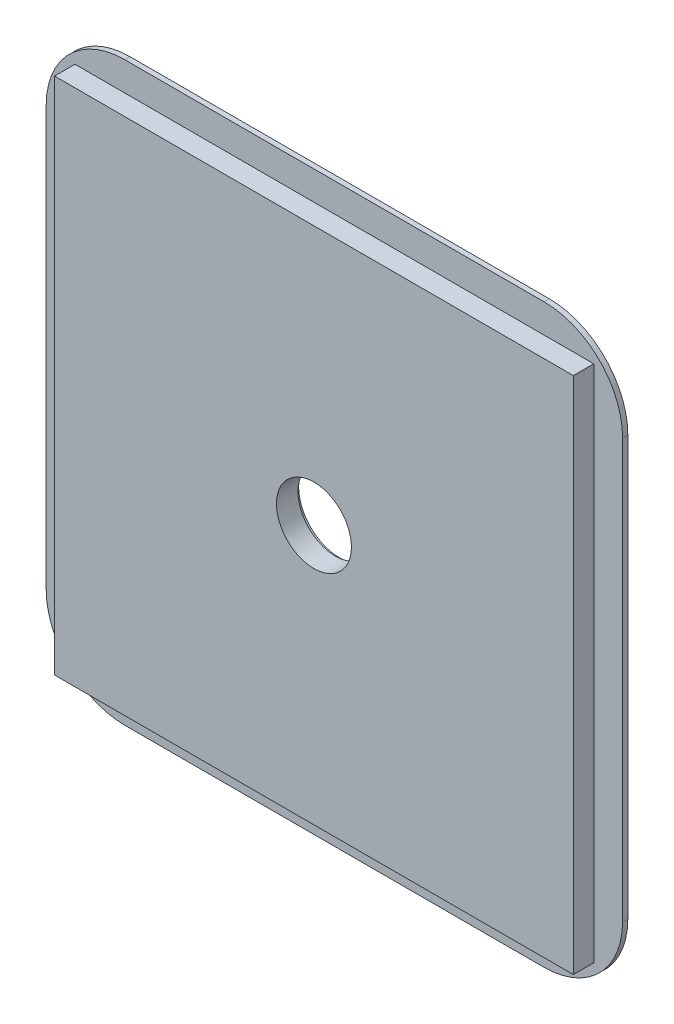
ISO-10303-21;
HEADER;
FILE_DESCRIPTION(('STEP AP214'),'2;1');
FILE_NAME('part.step','',(''),(''),'','','');
FILE_SCHEMA(('AUTOMOTIVE_DESIGN { 1 0 10303 214 1 1 1 1 }'));
ENDSEC;
DATA;
#1=APPLICATION_CONTEXT('core data for automotive mechanical design processes');
#2=APPLICATION_PROTOCOL_DEFINITION('international standard','automotive_design',2000,#1);
#3=PRODUCT_CONTEXT('',#1,'mechanical');
#4=PRODUCT('Part','Part','',(#3));
#5=PRODUCT_RELATED_PRODUCT_CATEGORY('part','',(#4));
#6=PRODUCT_DEFINITION_FORMATION('','',#4);
#7=PRODUCT_DEFINITION_CONTEXT('part definition',#1,'design');
#8=PRODUCT_DEFINITION('design','',#6,#7);
#9=PRODUCT_DEFINITION_SHAPE('','',#8);
#10=(LENGTH_UNIT() NAMED_UNIT(*) SI_UNIT(.MILLI.,.METRE.));
#11=(NAMED_UNIT(*) PLANE_ANGLE_UNIT() SI_UNIT($,.RADIAN.));
#12=(NAMED_UNIT(*) SI_UNIT($,.STERADIAN.) SOLID_ANGLE_UNIT());
#13=UNCERTAINTY_MEASURE_WITH_UNIT(LENGTH_MEASURE(1.E-05),#10,'distance_accuracy_value','');
#14=(GEOMETRIC_REPRESENTATION_CONTEXT(3) GLOBAL_UNCERTAINTY_ASSIGNED_CONTEXT((#13)) GLOBAL_UNIT_ASSIGNED_CONTEXT((#10,
#11,#12)) REPRESENTATION_CONTEXT('',''));
#15=CARTESIAN_POINT('',(0.,0.,0.));
#16=DIRECTION('',(0.,0.,1.));
#17=DIRECTION('',(1.,0.,0.));
#18=AXIS2_PLACEMENT_3D('',#15,#16,#17);
#19=CARTESIAN_POINT('',(0.,0.,3.9));
#20=DIRECTION('',(0.,0.,-1.));
#21=DIRECTION('',(-1.,0.,0.));
#22=AXIS2_PLACEMENT_3D('',#19,#20,#21);
#23=CYLINDRICAL_SURFACE('',#22,7.15);
#24=CARTESIAN_POINT('',(0.,0.,3.9));
#25=DIRECTION('',(0.,0.,-1.));
#26=DIRECTION('',(-1.,0.,0.));
#27=AXIS2_PLACEMENT_3D('',#24,#25,#26);
#28=CIRCLE('',#27,7.15);
#29=CARTESIAN_POINT('',(-7.15,0.,3.9));
#30=VERTEX_POINT('',#29);
#31=EDGE_CURVE('E178',#30,#30,#28,.T.);
#32=ORIENTED_EDGE('',*,*,#31,.F.);
#33=EDGE_LOOP('',(#32));
#34=FACE_BOUND('',#33,.T.);
#35=CARTESIAN_POINT('',(0.,0.,-0.2));
#36=DIRECTION('',(0.,0.,-1.));
#37=DIRECTION('',(-1.,0.,0.));
#38=AXIS2_PLACEMENT_3D('',#35,#36,#37);
#39=CIRCLE('',#38,7.15);
#40=CARTESIAN_POINT('',(-7.15,0.,-0.2));
#41=VERTEX_POINT('',#40);
#42=EDGE_CURVE('E174',#41,#41,#39,.F.);
#43=ORIENTED_EDGE('',*,*,#42,.F.);
#44=EDGE_LOOP('',(#43));
#45=FACE_BOUND('',#44,.T.);
#46=ADVANCED_FACE('F41',(#34,#45),#23,.F.);
#47=CARTESIAN_POINT('',(49.4999999999877,49.5000000000019,3.9));
#48=DIRECTION('',(-1.,0.,0.));
#49=DIRECTION('',(0.,0.,1.));
#50=AXIS2_PLACEMENT_3D('',#47,#48,#49);
#51=PLANE('',#50);
#52=DIRECTION('',(0.,1.,0.));
#53=VECTOR('',#52,1.);
#54=CARTESIAN_POINT('',(49.4999999999877,49.5000000000019,0.));
#55=LINE('',#54,#53);
#56=CARTESIAN_POINT('',(49.4999999999877,-49.4999999999877,0.));
#57=VERTEX_POINT('',#56);
#58=CARTESIAN_POINT('',(49.4999999999877,49.5000000000019,0.));
#59=VERTEX_POINT('',#58);
#60=EDGE_CURVE('E134',#57,#59,#55,.T.);
#61=ORIENTED_EDGE('',*,*,#60,.T.);
#62=DIRECTION('',(0.,0.,-1.));
#63=VECTOR('',#62,1.);
#64=CARTESIAN_POINT('',(49.4999999999877,49.5000000000019,3.9));
#65=LINE('',#64,#63);
#66=CARTESIAN_POINT('',(49.4999999999877,49.5000000000019,3.9));
#67=VERTEX_POINT('',#66);
#68=EDGE_CURVE('E144',#67,#59,#65,.T.);
#69=ORIENTED_EDGE('',*,*,#68,.F.);
#70=DIRECTION('',(0.,1.,0.));
#71=VECTOR('',#70,1.);
#72=CARTESIAN_POINT('',(49.4999999999877,49.5000000000019,3.9));
#73=LINE('',#72,#71);
#74=CARTESIAN_POINT('',(49.4999999999877,-49.4999999999877,3.9));
#75=VERTEX_POINT('',#74);
#76=EDGE_CURVE('E169',#75,#67,#73,.T.);
#77=ORIENTED_EDGE('',*,*,#76,.F.);
#78=DIRECTION('',(0.,0.,-1.));
#79=VECTOR('',#78,1.);
#80=CARTESIAN_POINT('',(49.4999999999877,-49.4999999999877,3.9));
#81=LINE('',#80,#79);
#82=EDGE_CURVE('E156',#75,#57,#81,.T.);
#83=ORIENTED_EDGE('',*,*,#82,.T.);
#84=EDGE_LOOP('',(#61,#69,#77,#83));
#85=FACE_BOUND('',#84,.T.);
#86=ADVANCED_FACE('F152',(#85),#51,.F.);
#87=CARTESIAN_POINT('',(-49.5000000000019,49.5000000000019,3.9));
#88=DIRECTION('',(0.,-1.,0.));
#89=DIRECTION('',(0.,0.,-1.));
#90=AXIS2_PLACEMENT_3D('',#87,#88,#89);
#91=PLANE('',#90);
#92=DIRECTION('',(-1.,0.,0.));
#93=VECTOR('',#92,1.);
#94=CARTESIAN_POINT('',(-49.5000000000019,49.5000000000019,0.));
#95=LINE('',#94,#93);
#96=CARTESIAN_POINT('',(-49.5000000000019,49.5000000000019,0.));
#97=VERTEX_POINT('',#96);
#98=EDGE_CURVE('E128',#59,#97,#95,.T.);
#99=ORIENTED_EDGE('',*,*,#98,.T.);
#100=DIRECTION('',(0.,0.,-1.));
#101=VECTOR('',#100,1.);
#102=CARTESIAN_POINT('',(-49.5000000000019,49.5000000000019,3.9));
#103=LINE('',#102,#101);
#104=CARTESIAN_POINT('',(-49.5000000000019,49.5000000000019,3.9));
#105=VERTEX_POINT('',#104);
#106=EDGE_CURVE('E153',#105,#97,#103,.T.);
#107=ORIENTED_EDGE('',*,*,#106,.F.);
#108=DIRECTION('',(-1.,0.,0.));
#109=VECTOR('',#108,1.);
#110=CARTESIAN_POINT('',(-49.5000000000019,49.5000000000019,3.9));
#111=LINE('',#110,#109);
#112=EDGE_CURVE('E147',#67,#105,#111,.T.);
#113=ORIENTED_EDGE('',*,*,#112,.F.);
#114=ORIENTED_EDGE('',*,*,#68,.T.);
#115=EDGE_LOOP('',(#99,#107,#113,#114));
#116=FACE_BOUND('',#115,.T.);
#117=ADVANCED_FACE('F143',(#116),#91,.F.);
#118=CARTESIAN_POINT('',(-49.5000000000019,49.5000000000019,3.9));
#119=DIRECTION('',(1.,0.,0.));
#120=DIRECTION('',(0.,0.,-1.));
#121=AXIS2_PLACEMENT_3D('',#118,#119,#120);
#122=PLANE('',#121);
#123=DIRECTION('',(0.,-1.,0.));
#124=VECTOR('',#123,1.);
#125=CARTESIAN_POINT('',(-49.5000000000019,49.5000000000019,0.));
#126=LINE('',#125,#124);
#127=CARTESIAN_POINT('',(-49.5000000000019,-49.4999999999877,0.));
#128=VERTEX_POINT('',#127);
#129=EDGE_CURVE('E137',#97,#128,#126,.T.);
#130=ORIENTED_EDGE('',*,*,#129,.T.);
#131=DIRECTION('',(0.,0.,-1.));
#132=VECTOR('',#131,1.);
#133=CARTESIAN_POINT('',(-49.5000000000019,-49.4999999999877,3.9));
#134=LINE('',#133,#132);
#135=CARTESIAN_POINT('',(-49.5000000000019,-49.4999999999877,3.9));
#136=VERTEX_POINT('',#135);
#137=EDGE_CURVE('E171',#136,#128,#134,.T.);
#138=ORIENTED_EDGE('',*,*,#137,.F.);
#139=DIRECTION('',(0.,-1.,0.));
#140=VECTOR('',#139,1.);
#141=CARTESIAN_POINT('',(-49.5000000000019,49.5000000000019,3.9));
#142=LINE('',#141,#140);
#143=EDGE_CURVE('E231',#105,#136,#142,.T.);
#144=ORIENTED_EDGE('',*,*,#143,.F.);
#145=ORIENTED_EDGE('',*,*,#106,.T.);
#146=EDGE_LOOP('',(#130,#138,#144,#145));
#147=FACE_BOUND('',#146,.T.);
#148=ADVANCED_FACE('F245',(#147),#122,.F.);
#149=CARTESIAN_POINT('',(-49.5000000000019,-49.4999999999877,3.9));
#150=DIRECTION('',(0.,1.,0.));
#151=DIRECTION('',(0.,0.,1.));
#152=AXIS2_PLACEMENT_3D('',#149,#150,#151);
#153=PLANE('',#152);
#154=DIRECTION('',(1.,0.,0.));
#155=VECTOR('',#154,1.);
#156=CARTESIAN_POINT('',(-49.5000000000019,-49.4999999999877,0.));
#157=LINE('',#156,#155);
#158=EDGE_CURVE('E170',#128,#57,#157,.T.);
#159=ORIENTED_EDGE('',*,*,#158,.T.);
#160=ORIENTED_EDGE('',*,*,#82,.F.);
#161=DIRECTION('',(1.,0.,0.));
#162=VECTOR('',#161,1.);
#163=CARTESIAN_POINT('',(-49.5000000000019,-49.4999999999877,3.9));
#164=LINE('',#163,#162);
#165=EDGE_CURVE('E161',#136,#75,#164,.T.);
#166=ORIENTED_EDGE('',*,*,#165,.F.);
#167=ORIENTED_EDGE('',*,*,#137,.T.);
#168=EDGE_LOOP('',(#159,#160,#166,#167));
#169=FACE_BOUND('',#168,.T.);
#170=ADVANCED_FACE('F239',(#169),#153,.F.);
#171=CARTESIAN_POINT('',(0.,0.,3.9));
#172=DIRECTION('',(0.,0.,1.));
#173=DIRECTION('',(1.,0.,0.));
#174=AXIS2_PLACEMENT_3D('',#171,#172,#173);
#175=PLANE('',#174);
#176=ORIENTED_EDGE('',*,*,#31,.T.);
#177=EDGE_LOOP('',(#176));
#178=FACE_BOUND('',#177,.T.);
#179=ORIENTED_EDGE('',*,*,#76,.T.);
#180=ORIENTED_EDGE('',*,*,#112,.T.);
#181=ORIENTED_EDGE('',*,*,#143,.T.);
#182=ORIENTED_EDGE('',*,*,#165,.T.);
#183=EDGE_LOOP('',(#179,#180,#181,#182));
#184=FACE_BOUND('',#183,.T.);
#185=ADVANCED_FACE('F238',(#178,#184),#175,.T.);
#186=CARTESIAN_POINT('',(-55.,55.,-1.));
#187=DIRECTION('',(1.,0.,0.));
#188=DIRECTION('',(0.,1.,0.));
#189=AXIS2_PLACEMENT_3D('',#186,#187,#188);
#190=PLANE('',#189);
#191=DIRECTION('',(0.,1.,0.));
#192=VECTOR('',#191,1.);
#193=CARTESIAN_POINT('',(-55.,55.,-1.));
#194=LINE('',#193,#192);
#195=CARTESIAN_POINT('',(-55.,-40.,-1.));
#196=VERTEX_POINT('',#195);
#197=CARTESIAN_POINT('',(-55.,40.,-1.));
#198=VERTEX_POINT('',#197);
#199=EDGE_CURVE('E233',#196,#198,#194,.T.);
#200=ORIENTED_EDGE('',*,*,#199,.F.);
#201=DIRECTION('',(0.,0.,1.));
#202=VECTOR('',#201,1.);
#203=CARTESIAN_POINT('',(-55.,-40.,-1.));
#204=LINE('',#203,#202);
#205=CARTESIAN_POINT('',(-55.,-40.,0.));
#206=VERTEX_POINT('',#205);
#207=EDGE_CURVE('E181',#196,#206,#204,.T.);
#208=ORIENTED_EDGE('',*,*,#207,.T.);
#209=DIRECTION('',(0.,1.,0.));
#210=VECTOR('',#209,1.);
#211=CARTESIAN_POINT('',(-55.,55.,0.));
#212=LINE('',#211,#210);
#213=CARTESIAN_POINT('',(-55.,40.,0.));
#214=VERTEX_POINT('',#213);
#215=EDGE_CURVE('E222',#206,#214,#212,.T.);
#216=ORIENTED_EDGE('',*,*,#215,.T.);
#217=DIRECTION('',(0.,0.,1.));
#218=VECTOR('',#217,1.);
#219=CARTESIAN_POINT('',(-55.,40.,-1.));
#220=LINE('',#219,#218);
#221=EDGE_CURVE('E148',#214,#198,#220,.F.);
#222=ORIENTED_EDGE('',*,*,#221,.T.);
#223=EDGE_LOOP('',(#200,#208,#216,#222));
#224=FACE_BOUND('',#223,.T.);
#225=ADVANCED_FACE('F285',(#224),#190,.F.);
#226=CARTESIAN_POINT('',(55.,55.,-1.));
#227=DIRECTION('',(0.,-1.,0.));
#228=DIRECTION('',(0.,0.,-1.));
#229=AXIS2_PLACEMENT_3D('',#226,#227,#228);
#230=PLANE('',#229);
#231=DIRECTION('',(1.,0.,0.));
#232=VECTOR('',#231,1.);
#233=CARTESIAN_POINT('',(55.,55.,-1.));
#234=LINE('',#233,#232);
#235=CARTESIAN_POINT('',(-40.,55.,-1.));
#236=VERTEX_POINT('',#235);
#237=CARTESIAN_POINT('',(40.,55.,-1.));
#238=VERTEX_POINT('',#237);
#239=EDGE_CURVE('E218',#236,#238,#234,.T.);
#240=ORIENTED_EDGE('',*,*,#239,.F.);
#241=DIRECTION('',(0.,0.,1.));
#242=VECTOR('',#241,1.);
#243=CARTESIAN_POINT('',(-40.,55.,-1.));
#244=LINE('',#243,#242);
#245=CARTESIAN_POINT('',(-40.,55.,0.));
#246=VERTEX_POINT('',#245);
#247=EDGE_CURVE('E207',#236,#246,#244,.T.);
#248=ORIENTED_EDGE('',*,*,#247,.T.);
#249=DIRECTION('',(1.,0.,0.));
#250=VECTOR('',#249,1.);
#251=CARTESIAN_POINT('',(55.,55.,0.));
#252=LINE('',#251,#250);
#253=CARTESIAN_POINT('',(40.,55.,0.));
#254=VERTEX_POINT('',#253);
#255=EDGE_CURVE('E211',#246,#254,#252,.T.);
#256=ORIENTED_EDGE('',*,*,#255,.T.);
#257=DIRECTION('',(0.,0.,1.));
#258=VECTOR('',#257,1.);
#259=CARTESIAN_POINT('',(40.,55.,-1.));
#260=LINE('',#259,#258);
#261=EDGE_CURVE('E203',#254,#238,#260,.F.);
#262=ORIENTED_EDGE('',*,*,#261,.T.);
#263=EDGE_LOOP('',(#240,#248,#256,#262));
#264=FACE_BOUND('',#263,.T.);
#265=ADVANCED_FACE('F214',(#264),#230,.F.);
#266=CARTESIAN_POINT('',(55.,55.,-1.));
#267=DIRECTION('',(-1.,0.,0.));
#268=DIRECTION('',(0.,-1.,0.));
#269=AXIS2_PLACEMENT_3D('',#266,#267,#268);
#270=PLANE('',#269);
#271=DIRECTION('',(0.,-1.,0.));
#272=VECTOR('',#271,1.);
#273=CARTESIAN_POINT('',(55.,55.,-1.));
#274=LINE('',#273,#272);
#275=CARTESIAN_POINT('',(55.,40.,-1.));
#276=VERTEX_POINT('',#275);
#277=CARTESIAN_POINT('',(55.,-40.,-1.));
#278=VERTEX_POINT('',#277);
#279=EDGE_CURVE('E159',#276,#278,#274,.T.);
#280=ORIENTED_EDGE('',*,*,#279,.F.);
#281=DIRECTION('',(0.,0.,1.));
#282=VECTOR('',#281,1.);
#283=CARTESIAN_POINT('',(55.,40.,-1.));
#284=LINE('',#283,#282);
#285=CARTESIAN_POINT('',(55.,40.,0.));
#286=VERTEX_POINT('',#285);
#287=EDGE_CURVE('E11',#276,#286,#284,.T.);
#288=ORIENTED_EDGE('',*,*,#287,.T.);
#289=DIRECTION('',(0.,-1.,0.));
#290=VECTOR('',#289,1.);
#291=CARTESIAN_POINT('',(55.,55.,0.));
#292=LINE('',#291,#290);
#293=CARTESIAN_POINT('',(55.,-40.,0.));
#294=VERTEX_POINT('',#293);
#295=EDGE_CURVE('E225',#286,#294,#292,.T.);
#296=ORIENTED_EDGE('',*,*,#295,.T.);
#297=DIRECTION('',(0.,0.,1.));
#298=VECTOR('',#297,1.);
#299=CARTESIAN_POINT('',(55.,-40.,-1.));
#300=LINE('',#299,#298);
#301=EDGE_CURVE('E47',#294,#278,#300,.F.);
#302=ORIENTED_EDGE('',*,*,#301,.T.);
#303=EDGE_LOOP('',(#280,#288,#296,#302));
#304=FACE_BOUND('',#303,.T.);
#305=ADVANCED_FACE('F277',(#304),#270,.F.);
#306=CARTESIAN_POINT('',(55.,-55.,-1.));
#307=DIRECTION('',(0.,1.,0.));
#308=DIRECTION('',(0.,0.,1.));
#309=AXIS2_PLACEMENT_3D('',#306,#307,#308);
#310=PLANE('',#309);
#311=DIRECTION('',(-1.,0.,0.));
#312=VECTOR('',#311,1.);
#313=CARTESIAN_POINT('',(55.,-55.,0.));
#314=LINE('',#313,#312);
#315=CARTESIAN_POINT('',(40.,-55.,0.));
#316=VERTEX_POINT('',#315);
#317=CARTESIAN_POINT('',(-40.,-55.,0.));
#318=VERTEX_POINT('',#317);
#319=EDGE_CURVE('E224',#316,#318,#314,.T.);
#320=ORIENTED_EDGE('',*,*,#319,.T.);
#321=DIRECTION('',(0.,0.,1.));
#322=VECTOR('',#321,1.);
#323=CARTESIAN_POINT('',(-40.,-55.,-1.));
#324=LINE('',#323,#322);
#325=CARTESIAN_POINT('',(-40.,-55.,-1.));
#326=VERTEX_POINT('',#325);
#327=EDGE_CURVE('E193',#318,#326,#324,.F.);
#328=ORIENTED_EDGE('',*,*,#327,.T.);
#329=DIRECTION('',(-1.,0.,0.));
#330=VECTOR('',#329,1.);
#331=CARTESIAN_POINT('',(55.,-55.,-1.));
#332=LINE('',#331,#330);
#333=CARTESIAN_POINT('',(40.,-55.,-1.));
#334=VERTEX_POINT('',#333);
#335=EDGE_CURVE('E160',#334,#326,#332,.T.);
#336=ORIENTED_EDGE('',*,*,#335,.F.);
#337=DIRECTION('',(0.,0.,1.));
#338=VECTOR('',#337,1.);
#339=CARTESIAN_POINT('',(40.,-55.,-1.));
#340=LINE('',#339,#338);
#341=EDGE_CURVE('E195',#334,#316,#340,.T.);
#342=ORIENTED_EDGE('',*,*,#341,.T.);
#343=EDGE_LOOP('',(#320,#328,#336,#342));
#344=FACE_BOUND('',#343,.T.);
#345=ADVANCED_FACE('F268',(#344),#310,.F.);
#346=CARTESIAN_POINT('',(0.,0.,-1.));
#347=DIRECTION('',(0.,0.,-1.));
#348=DIRECTION('',(-1.,0.,0.));
#349=AXIS2_PLACEMENT_3D('',#346,#347,#348);
#350=PLANE('',#349);
#351=CARTESIAN_POINT('',(0.,0.,-1.));
#352=DIRECTION('',(0.,0.,-1.));
#353=DIRECTION('',(-1.,0.,0.));
#354=AXIS2_PLACEMENT_3D('',#351,#352,#353);
#355=CIRCLE('',#354,7.825);
#356=CARTESIAN_POINT('',(-7.825,0.,-1.));
#357=VERTEX_POINT('',#356);
#358=EDGE_CURVE('E291',#357,#357,#355,.T.);
#359=ORIENTED_EDGE('',*,*,#358,.F.);
#360=EDGE_LOOP('',(#359));
#361=FACE_BOUND('',#360,.T.);
#362=ORIENTED_EDGE('',*,*,#335,.T.);
#363=CARTESIAN_POINT('',(-40.,-40.,-1.));
#364=DIRECTION('',(0.,0.,-1.));
#365=DIRECTION('',(-1.,0.,0.));
#366=AXIS2_PLACEMENT_3D('',#363,#364,#365);
#367=CIRCLE('',#366,15.);
#368=EDGE_CURVE('E205',#326,#196,#367,.T.);
#369=ORIENTED_EDGE('',*,*,#368,.T.);
#370=ORIENTED_EDGE('',*,*,#199,.T.);
#371=CARTESIAN_POINT('',(-40.,40.,-1.));
#372=DIRECTION('',(0.,0.,-1.));
#373=DIRECTION('',(-1.,0.,0.));
#374=AXIS2_PLACEMENT_3D('',#371,#372,#373);
#375=CIRCLE('',#374,15.);
#376=EDGE_CURVE('E199',#198,#236,#375,.T.);
#377=ORIENTED_EDGE('',*,*,#376,.T.);
#378=ORIENTED_EDGE('',*,*,#239,.T.);
#379=CARTESIAN_POINT('',(40.,40.,-1.));
#380=DIRECTION('',(0.,0.,-1.));
#381=DIRECTION('',(-1.,0.,0.));
#382=AXIS2_PLACEMENT_3D('',#379,#380,#381);
#383=CIRCLE('',#382,15.);
#384=EDGE_CURVE('E65',#238,#276,#383,.T.);
#385=ORIENTED_EDGE('',*,*,#384,.T.);
#386=ORIENTED_EDGE('',*,*,#279,.T.);
#387=CARTESIAN_POINT('',(40.,-40.,-1.));
#388=DIRECTION('',(0.,0.,-1.));
#389=DIRECTION('',(-1.,0.,0.));
#390=AXIS2_PLACEMENT_3D('',#387,#388,#389);
#391=CIRCLE('',#390,15.);
#392=EDGE_CURVE('E200',#278,#334,#391,.T.);
#393=ORIENTED_EDGE('',*,*,#392,.T.);
#394=EDGE_LOOP('',(#362,#369,#370,#377,#378,#385,#386,#393));
#395=FACE_BOUND('',#394,.T.);
#396=ADVANCED_FACE('F266',(#361,#395),#350,.T.);
#397=CARTESIAN_POINT('',(0.,0.,0.));
#398=DIRECTION('',(0.,0.,-1.));
#399=DIRECTION('',(-1.,0.,0.));
#400=AXIS2_PLACEMENT_3D('',#397,#398,#399);
#401=PLANE('',#400);
#402=ORIENTED_EDGE('',*,*,#60,.F.);
#403=ORIENTED_EDGE('',*,*,#158,.F.);
#404=ORIENTED_EDGE('',*,*,#129,.F.);
#405=ORIENTED_EDGE('',*,*,#98,.F.);
#406=EDGE_LOOP('',(#402,#403,#404,#405));
#407=FACE_BOUND('',#406,.T.);
#408=ORIENTED_EDGE('',*,*,#215,.F.);
#409=CARTESIAN_POINT('',(-40.,-40.,0.));
#410=DIRECTION('',(0.,0.,-1.));
#411=DIRECTION('',(-1.,0.,0.));
#412=AXIS2_PLACEMENT_3D('',#409,#410,#411);
#413=CIRCLE('',#412,15.);
#414=EDGE_CURVE('E188',#206,#318,#413,.F.);
#415=ORIENTED_EDGE('',*,*,#414,.T.);
#416=ORIENTED_EDGE('',*,*,#319,.F.);
#417=CARTESIAN_POINT('',(40.,-40.,0.));
#418=DIRECTION('',(0.,0.,-1.));
#419=DIRECTION('',(-1.,0.,0.));
#420=AXIS2_PLACEMENT_3D('',#417,#418,#419);
#421=CIRCLE('',#420,15.);
#422=EDGE_CURVE('E183',#316,#294,#421,.F.);
#423=ORIENTED_EDGE('',*,*,#422,.T.);
#424=ORIENTED_EDGE('',*,*,#295,.F.);
#425=CARTESIAN_POINT('',(40.,40.,0.));
#426=DIRECTION('',(0.,0.,-1.));
#427=DIRECTION('',(-1.,0.,0.));
#428=AXIS2_PLACEMENT_3D('',#425,#426,#427);
#429=CIRCLE('',#428,15.);
#430=EDGE_CURVE('E187',#286,#254,#429,.F.);
#431=ORIENTED_EDGE('',*,*,#430,.T.);
#432=ORIENTED_EDGE('',*,*,#255,.F.);
#433=CARTESIAN_POINT('',(-40.,40.,0.));
#434=DIRECTION('',(0.,0.,-1.));
#435=DIRECTION('',(-1.,0.,0.));
#436=AXIS2_PLACEMENT_3D('',#433,#434,#435);
#437=CIRCLE('',#436,15.);
#438=EDGE_CURVE('E189',#246,#214,#437,.F.);
#439=ORIENTED_EDGE('',*,*,#438,.T.);
#440=EDGE_LOOP('',(#408,#415,#416,#423,#424,#431,#432,#439));
#441=FACE_BOUND('',#440,.T.);
#442=ADVANCED_FACE('F135',(#407,#441),#401,.F.);
#443=CARTESIAN_POINT('',(0.,0.,-0.2));
#444=DIRECTION('',(0.,0.,-1.));
#445=DIRECTION('',(-1.,0.,0.));
#446=AXIS2_PLACEMENT_3D('',#443,#444,#445);
#447=PLANE('',#446);
#448=CARTESIAN_POINT('',(0.,0.,-0.2));
#449=DIRECTION('',(0.,0.,-1.));
#450=DIRECTION('',(-1.,0.,0.));
#451=AXIS2_PLACEMENT_3D('',#448,#449,#450);
#452=CIRCLE('',#451,7.825);
#453=CARTESIAN_POINT('',(-7.825,0.,-0.2));
#454=VERTEX_POINT('',#453);
#455=EDGE_CURVE('E177',#454,#454,#452,.T.);
#456=ORIENTED_EDGE('',*,*,#455,.T.);
#457=EDGE_LOOP('',(#456));
#458=FACE_BOUND('',#457,.T.);
#459=ORIENTED_EDGE('',*,*,#42,.T.);
#460=EDGE_LOOP('',(#459));
#461=FACE_BOUND('',#460,.T.);
#462=ADVANCED_FACE('F271',(#458,#461),#447,.T.);
#463=CARTESIAN_POINT('',(0.,0.,-0.2));
#464=DIRECTION('',(0.,0.,-1.));
#465=DIRECTION('',(-1.,0.,0.));
#466=AXIS2_PLACEMENT_3D('',#463,#464,#465);
#467=CYLINDRICAL_SURFACE('',#466,7.825);
#468=ORIENTED_EDGE('',*,*,#455,.F.);
#469=EDGE_LOOP('',(#468));
#470=FACE_BOUND('',#469,.T.);
#471=ORIENTED_EDGE('',*,*,#358,.T.);
#472=EDGE_LOOP('',(#471));
#473=FACE_BOUND('',#472,.T.);
#474=ADVANCED_FACE('F262',(#470,#473),#467,.F.);
#475=CARTESIAN_POINT('',(-40.,-40.,-1.));
#476=DIRECTION('',(0.,0.,1.));
#477=DIRECTION('',(1.,0.,0.));
#478=AXIS2_PLACEMENT_3D('',#475,#476,#477);
#479=CYLINDRICAL_SURFACE('',#478,15.);
#480=ORIENTED_EDGE('',*,*,#368,.F.);
#481=ORIENTED_EDGE('',*,*,#327,.F.);
#482=ORIENTED_EDGE('',*,*,#414,.F.);
#483=ORIENTED_EDGE('',*,*,#207,.F.);
#484=EDGE_LOOP('',(#480,#481,#482,#483));
#485=FACE_BOUND('',#484,.T.);
#486=ADVANCED_FACE('F308',(#485),#479,.T.);
#487=CARTESIAN_POINT('',(-40.,40.,-1.));
#488=DIRECTION('',(0.,0.,1.));
#489=DIRECTION('',(1.,0.,0.));
#490=AXIS2_PLACEMENT_3D('',#487,#488,#489);
#491=CYLINDRICAL_SURFACE('',#490,15.);
#492=ORIENTED_EDGE('',*,*,#376,.F.);
#493=ORIENTED_EDGE('',*,*,#221,.F.);
#494=ORIENTED_EDGE('',*,*,#438,.F.);
#495=ORIENTED_EDGE('',*,*,#247,.F.);
#496=EDGE_LOOP('',(#492,#493,#494,#495));
#497=FACE_BOUND('',#496,.T.);
#498=ADVANCED_FACE('F311',(#497),#491,.T.);
#499=CARTESIAN_POINT('',(40.,40.,-1.));
#500=DIRECTION('',(0.,0.,1.));
#501=DIRECTION('',(1.,0.,0.));
#502=AXIS2_PLACEMENT_3D('',#499,#500,#501);
#503=CYLINDRICAL_SURFACE('',#502,15.);
#504=ORIENTED_EDGE('',*,*,#384,.F.);
#505=ORIENTED_EDGE('',*,*,#261,.F.);
#506=ORIENTED_EDGE('',*,*,#430,.F.);
#507=ORIENTED_EDGE('',*,*,#287,.F.);
#508=EDGE_LOOP('',(#504,#505,#506,#507));
#509=FACE_BOUND('',#508,.T.);
#510=ADVANCED_FACE('F312',(#509),#503,.T.);
#511=CARTESIAN_POINT('',(40.,-40.,-1.));
#512=DIRECTION('',(0.,0.,1.));
#513=DIRECTION('',(1.,0.,0.));
#514=AXIS2_PLACEMENT_3D('',#511,#512,#513);
#515=CYLINDRICAL_SURFACE('',#514,15.);
#516=ORIENTED_EDGE('',*,*,#392,.F.);
#517=ORIENTED_EDGE('',*,*,#301,.F.);
#518=ORIENTED_EDGE('',*,*,#422,.F.);
#519=ORIENTED_EDGE('',*,*,#341,.F.);
#520=EDGE_LOOP('',(#516,#517,#518,#519));
#521=FACE_BOUND('',#520,.T.);
#522=ADVANCED_FACE('F43',(#521),#515,.T.);
#523=CLOSED_SHELL('',(#46,#86,#117,#148,#170,#185,#225,#265,#305,#345,#396,#442,#462,#474,#486,
#498,#510,#522));
#524=MANIFOLD_SOLID_BREP('B2',#523);
#525=ADVANCED_BREP_SHAPE_REPRESENTATION('',(#18,#524),#14);
#526=SHAPE_DEFINITION_REPRESENTATION(#9,#525);
ENDSEC;
END-ISO-10303-21;
